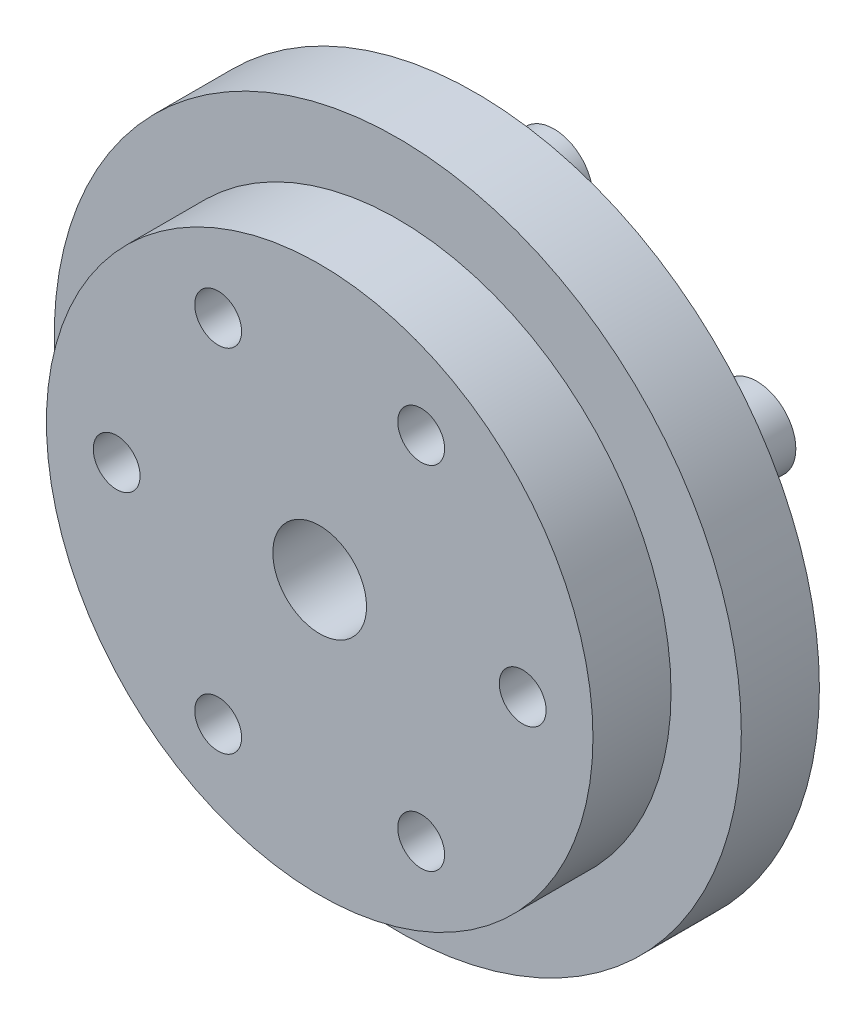
ISO-10303-21;
HEADER;
FILE_DESCRIPTION(('STEP AP214'),'2;1');
FILE_NAME('part.step','',(''),(''),'','','');
FILE_SCHEMA(('AUTOMOTIVE_DESIGN { 1 0 10303 214 1 1 1 1 }'));
ENDSEC;
DATA;
#1=APPLICATION_CONTEXT('core data for automotive mechanical design processes');
#2=APPLICATION_PROTOCOL_DEFINITION('international standard','automotive_design',2000,#1);
#3=PRODUCT_CONTEXT('',#1,'mechanical');
#4=PRODUCT('Part','Part','',(#3));
#5=PRODUCT_RELATED_PRODUCT_CATEGORY('part','',(#4));
#6=PRODUCT_DEFINITION_FORMATION('','',#4);
#7=PRODUCT_DEFINITION_CONTEXT('part definition',#1,'design');
#8=PRODUCT_DEFINITION('design','',#6,#7);
#9=PRODUCT_DEFINITION_SHAPE('','',#8);
#10=(LENGTH_UNIT() NAMED_UNIT(*) SI_UNIT(.MILLI.,.METRE.));
#11=(NAMED_UNIT(*) PLANE_ANGLE_UNIT() SI_UNIT($,.RADIAN.));
#12=(NAMED_UNIT(*) SI_UNIT($,.STERADIAN.) SOLID_ANGLE_UNIT());
#13=UNCERTAINTY_MEASURE_WITH_UNIT(LENGTH_MEASURE(1.E-05),#10,'distance_accuracy_value','');
#14=(GEOMETRIC_REPRESENTATION_CONTEXT(3) GLOBAL_UNCERTAINTY_ASSIGNED_CONTEXT((#13)) GLOBAL_UNIT_ASSIGNED_CONTEXT((#10,
#11,#12)) REPRESENTATION_CONTEXT('',''));
#15=CARTESIAN_POINT('',(0.,0.,0.));
#16=DIRECTION('',(0.,0.,1.));
#17=DIRECTION('',(1.,0.,0.));
#18=AXIS2_PLACEMENT_3D('',#15,#16,#17);
#19=CARTESIAN_POINT('',(0.,0.,0.));
#20=DIRECTION('',(0.,0.,1.));
#21=DIRECTION('',(1.,0.,0.));
#22=AXIS2_PLACEMENT_3D('',#19,#20,#21);
#23=CYLINDRICAL_SURFACE('',#22,8.);
#24=CARTESIAN_POINT('',(0.,0.,0.));
#25=DIRECTION('',(0.,0.,1.));
#26=DIRECTION('',(1.,0.,0.));
#27=AXIS2_PLACEMENT_3D('',#24,#25,#26);
#28=CIRCLE('',#27,8.);
#29=CARTESIAN_POINT('',(8.,0.,0.));
#30=VERTEX_POINT('',#29);
#31=EDGE_CURVE('E76',#30,#30,#28,.T.);
#32=ORIENTED_EDGE('',*,*,#31,.F.);
#33=EDGE_LOOP('',(#32));
#34=FACE_BOUND('',#33,.T.);
#35=CARTESIAN_POINT('',(0.,0.,5.));
#36=DIRECTION('',(0.,0.,1.));
#37=DIRECTION('',(1.,0.,0.));
#38=AXIS2_PLACEMENT_3D('',#35,#36,#37);
#39=CIRCLE('',#38,8.);
#40=CARTESIAN_POINT('',(8.,0.,5.));
#41=VERTEX_POINT('',#40);
#42=EDGE_CURVE('E10',#41,#41,#39,.F.);
#43=ORIENTED_EDGE('',*,*,#42,.F.);
#44=EDGE_LOOP('',(#43));
#45=FACE_BOUND('',#44,.T.);
#46=ADVANCED_FACE('F35',(#34,#45),#23,.F.);
#47=CARTESIAN_POINT('',(0.,0.,5.));
#48=DIRECTION('',(0.,0.,-1.));
#49=DIRECTION('',(-1.,0.,0.));
#50=AXIS2_PLACEMENT_3D('',#47,#48,#49);
#51=CYLINDRICAL_SURFACE('',#50,22.);
#52=CARTESIAN_POINT('',(0.,0.,5.));
#53=DIRECTION('',(0.,0.,1.));
#54=DIRECTION('',(1.,0.,0.));
#55=AXIS2_PLACEMENT_3D('',#52,#53,#54);
#56=CIRCLE('',#55,22.);
#57=CARTESIAN_POINT('',(22.,0.,5.));
#58=VERTEX_POINT('',#57);
#59=EDGE_CURVE('E68',#58,#58,#56,.T.);
#60=ORIENTED_EDGE('',*,*,#59,.F.);
#61=EDGE_LOOP('',(#60));
#62=FACE_BOUND('',#61,.T.);
#63=CARTESIAN_POINT('',(0.,0.,0.));
#64=DIRECTION('',(0.,0.,1.));
#65=DIRECTION('',(1.,0.,0.));
#66=AXIS2_PLACEMENT_3D('',#63,#64,#65);
#67=CIRCLE('',#66,22.);
#68=CARTESIAN_POINT('',(22.,0.,0.));
#69=VERTEX_POINT('',#68);
#70=EDGE_CURVE('E65',#69,#69,#67,.T.);
#71=ORIENTED_EDGE('',*,*,#70,.T.);
#72=EDGE_LOOP('',(#71));
#73=FACE_BOUND('',#72,.T.);
#74=ADVANCED_FACE('F37',(#62,#73),#51,.T.);
#75=CARTESIAN_POINT('',(0.,0.,5.));
#76=DIRECTION('',(0.,0.,1.));
#77=DIRECTION('',(1.,0.,0.));
#78=AXIS2_PLACEMENT_3D('',#75,#76,#77);
#79=PLANE('',#78);
#80=CARTESIAN_POINT('',(0.,0.,5.));
#81=DIRECTION('',(0.,0.,1.));
#82=DIRECTION('',(1.,0.,0.));
#83=AXIS2_PLACEMENT_3D('',#80,#81,#82);
#84=CIRCLE('',#83,17.5);
#85=CARTESIAN_POINT('',(17.5,0.,5.));
#86=VERTEX_POINT('',#85);
#87=EDGE_CURVE('E64',#86,#86,#84,.T.);
#88=ORIENTED_EDGE('',*,*,#87,.F.);
#89=EDGE_LOOP('',(#88));
#90=FACE_BOUND('',#89,.T.);
#91=ORIENTED_EDGE('',*,*,#59,.T.);
#92=EDGE_LOOP('',(#91));
#93=FACE_BOUND('',#92,.T.);
#94=ADVANCED_FACE('F172',(#90,#93),#79,.T.);
#95=CARTESIAN_POINT('',(0.,0.,0.));
#96=DIRECTION('',(0.,0.,1.));
#97=DIRECTION('',(1.,0.,0.));
#98=AXIS2_PLACEMENT_3D('',#95,#96,#97);
#99=PLANE('',#98);
#100=CARTESIAN_POINT('',(12.9903810567665,7.50000000000015,0.));
#101=DIRECTION('',(0.,0.,1.));
#102=DIRECTION('',(1.,0.,0.));
#103=AXIS2_PLACEMENT_3D('',#100,#101,#102);
#104=CIRCLE('',#103,2.5);
#105=CARTESIAN_POINT('',(15.4903810567665,7.50000000000015,0.));
#106=VERTEX_POINT('',#105);
#107=EDGE_CURVE('E42',#106,#106,#104,.F.);
#108=ORIENTED_EDGE('',*,*,#107,.F.);
#109=EDGE_LOOP('',(#108));
#110=FACE_BOUND('',#109,.T.);
#111=CARTESIAN_POINT('',(12.9903810567667,-7.49999999999988,0.));
#112=DIRECTION('',(0.,0.,1.));
#113=DIRECTION('',(1.,0.,0.));
#114=AXIS2_PLACEMENT_3D('',#111,#112,#113);
#115=CIRCLE('',#114,2.5);
#116=CARTESIAN_POINT('',(15.4903810567667,-7.49999999999988,0.));
#117=VERTEX_POINT('',#116);
#118=EDGE_CURVE('E46',#117,#117,#115,.F.);
#119=ORIENTED_EDGE('',*,*,#118,.F.);
#120=EDGE_LOOP('',(#119));
#121=FACE_BOUND('',#120,.T.);
#122=CARTESIAN_POINT('',(1.04744440165294E-13,-15.,0.));
#123=DIRECTION('',(0.,0.,1.));
#124=DIRECTION('',(1.,0.,0.));
#125=AXIS2_PLACEMENT_3D('',#122,#123,#124);
#126=CIRCLE('',#125,2.5);
#127=CARTESIAN_POINT('',(2.5000000000001,-15.,0.));
#128=VERTEX_POINT('',#127);
#129=EDGE_CURVE('E50',#128,#128,#126,.F.);
#130=ORIENTED_EDGE('',*,*,#129,.F.);
#131=EDGE_LOOP('',(#130));
#132=FACE_BOUND('',#131,.T.);
#133=CARTESIAN_POINT('',(-12.9903810567665,-7.50000000000006,0.));
#134=DIRECTION('',(0.,0.,1.));
#135=DIRECTION('',(1.,0.,0.));
#136=AXIS2_PLACEMENT_3D('',#133,#134,#135);
#137=CIRCLE('',#136,2.5);
#138=CARTESIAN_POINT('',(-10.4903810567665,-7.50000000000006,0.));
#139=VERTEX_POINT('',#138);
#140=EDGE_CURVE('E55',#139,#139,#137,.F.);
#141=ORIENTED_EDGE('',*,*,#140,.F.);
#142=EDGE_LOOP('',(#141));
#143=FACE_BOUND('',#142,.T.);
#144=CARTESIAN_POINT('',(-12.9903810567666,7.49999999999997,0.));
#145=DIRECTION('',(0.,0.,1.));
#146=DIRECTION('',(1.,0.,0.));
#147=AXIS2_PLACEMENT_3D('',#144,#145,#146);
#148=CIRCLE('',#147,2.5);
#149=CARTESIAN_POINT('',(-10.4903810567666,7.49999999999997,0.));
#150=VERTEX_POINT('',#149);
#151=EDGE_CURVE('E58',#150,#150,#148,.F.);
#152=ORIENTED_EDGE('',*,*,#151,.F.);
#153=EDGE_LOOP('',(#152));
#154=FACE_BOUND('',#153,.T.);
#155=CARTESIAN_POINT('',(0.,15.,0.));
#156=DIRECTION('',(0.,0.,1.));
#157=DIRECTION('',(1.,0.,0.));
#158=AXIS2_PLACEMENT_3D('',#155,#156,#157);
#159=CIRCLE('',#158,2.5);
#160=CARTESIAN_POINT('',(2.5,15.,0.));
#161=VERTEX_POINT('',#160);
#162=EDGE_CURVE('E61',#161,#161,#159,.F.);
#163=ORIENTED_EDGE('',*,*,#162,.F.);
#164=EDGE_LOOP('',(#163));
#165=FACE_BOUND('',#164,.T.);
#166=ORIENTED_EDGE('',*,*,#31,.T.);
#167=EDGE_LOOP('',(#166));
#168=FACE_BOUND('',#167,.T.);
#169=ORIENTED_EDGE('',*,*,#70,.F.);
#170=EDGE_LOOP('',(#169));
#171=FACE_BOUND('',#170,.T.);
#172=ADVANCED_FACE('F161',(#110,#121,#132,#143,#154,#165,#168,#171),#99,.F.);
#173=CARTESIAN_POINT('',(0.,0.,10.));
#174=DIRECTION('',(0.,0.,-1.));
#175=DIRECTION('',(-1.,0.,0.));
#176=AXIS2_PLACEMENT_3D('',#173,#174,#175);
#177=CYLINDRICAL_SURFACE('',#176,17.5);
#178=CARTESIAN_POINT('',(0.,0.,10.));
#179=DIRECTION('',(0.,0.,1.));
#180=DIRECTION('',(1.,0.,0.));
#181=AXIS2_PLACEMENT_3D('',#178,#179,#180);
#182=CIRCLE('',#181,17.5);
#183=CARTESIAN_POINT('',(17.5,0.,10.));
#184=VERTEX_POINT('',#183);
#185=EDGE_CURVE('E69',#184,#184,#182,.T.);
#186=ORIENTED_EDGE('',*,*,#185,.F.);
#187=EDGE_LOOP('',(#186));
#188=FACE_BOUND('',#187,.T.);
#189=ORIENTED_EDGE('',*,*,#87,.T.);
#190=EDGE_LOOP('',(#189));
#191=FACE_BOUND('',#190,.T.);
#192=ADVANCED_FACE('F151',(#188,#191),#177,.T.);
#193=CARTESIAN_POINT('',(0.,0.,10.));
#194=DIRECTION('',(0.,0.,1.));
#195=DIRECTION('',(1.,0.,0.));
#196=AXIS2_PLACEMENT_3D('',#193,#194,#195);
#197=PLANE('',#196);
#198=CARTESIAN_POINT('',(13.,0.,10.));
#199=DIRECTION('',(0.,0.,1.));
#200=DIRECTION('',(1.,0.,0.));
#201=AXIS2_PLACEMENT_3D('',#198,#199,#200);
#202=CIRCLE('',#201,1.5);
#203=CARTESIAN_POINT('',(14.5,0.,10.));
#204=VERTEX_POINT('',#203);
#205=EDGE_CURVE('E105',#204,#204,#202,.T.);
#206=ORIENTED_EDGE('',*,*,#205,.F.);
#207=EDGE_LOOP('',(#206));
#208=FACE_BOUND('',#207,.T.);
#209=CARTESIAN_POINT('',(6.50000000000013,11.2583302491976,10.));
#210=DIRECTION('',(0.,0.,1.));
#211=DIRECTION('',(1.,0.,0.));
#212=AXIS2_PLACEMENT_3D('',#209,#210,#211);
#213=CIRCLE('',#212,1.5);
#214=CARTESIAN_POINT('',(8.00000000000013,11.2583302491976,10.));
#215=VERTEX_POINT('',#214);
#216=EDGE_CURVE('E84',#215,#215,#213,.T.);
#217=ORIENTED_EDGE('',*,*,#216,.F.);
#218=EDGE_LOOP('',(#217));
#219=FACE_BOUND('',#218,.T.);
#220=CARTESIAN_POINT('',(-6.4999999999999,11.2583302491978,10.));
#221=DIRECTION('',(0.,0.,1.));
#222=DIRECTION('',(1.,0.,0.));
#223=AXIS2_PLACEMENT_3D('',#220,#221,#222);
#224=CIRCLE('',#223,1.5);
#225=CARTESIAN_POINT('',(-4.9999999999999,11.2583302491978,10.));
#226=VERTEX_POINT('',#225);
#227=EDGE_CURVE('E83',#226,#226,#224,.T.);
#228=ORIENTED_EDGE('',*,*,#227,.F.);
#229=EDGE_LOOP('',(#228));
#230=FACE_BOUND('',#229,.T.);
#231=CARTESIAN_POINT('',(-13.,0.,10.));
#232=DIRECTION('',(0.,0.,1.));
#233=DIRECTION('',(1.,0.,0.));
#234=AXIS2_PLACEMENT_3D('',#231,#232,#233);
#235=CIRCLE('',#234,1.5);
#236=CARTESIAN_POINT('',(-11.5,0.,10.));
#237=VERTEX_POINT('',#236);
#238=EDGE_CURVE('E90',#237,#237,#235,.T.);
#239=ORIENTED_EDGE('',*,*,#238,.F.);
#240=EDGE_LOOP('',(#239));
#241=FACE_BOUND('',#240,.T.);
#242=CARTESIAN_POINT('',(-6.50000000000005,-11.2583302491977,10.));
#243=DIRECTION('',(0.,0.,1.));
#244=DIRECTION('',(1.,0.,0.));
#245=AXIS2_PLACEMENT_3D('',#242,#243,#244);
#246=CIRCLE('',#245,1.5);
#247=CARTESIAN_POINT('',(-5.00000000000005,-11.2583302491977,10.));
#248=VERTEX_POINT('',#247);
#249=EDGE_CURVE('E96',#248,#248,#246,.T.);
#250=ORIENTED_EDGE('',*,*,#249,.F.);
#251=EDGE_LOOP('',(#250));
#252=FACE_BOUND('',#251,.T.);
#253=CARTESIAN_POINT('',(6.49999999999997,-11.2583302491977,10.));
#254=DIRECTION('',(0.,0.,1.));
#255=DIRECTION('',(1.,0.,0.));
#256=AXIS2_PLACEMENT_3D('',#253,#254,#255);
#257=CIRCLE('',#256,1.5);
#258=CARTESIAN_POINT('',(7.99999999999997,-11.2583302491977,10.));
#259=VERTEX_POINT('',#258);
#260=EDGE_CURVE('E102',#259,#259,#257,.T.);
#261=ORIENTED_EDGE('',*,*,#260,.F.);
#262=EDGE_LOOP('',(#261));
#263=FACE_BOUND('',#262,.T.);
#264=ORIENTED_EDGE('',*,*,#185,.T.);
#265=EDGE_LOOP('',(#264));
#266=FACE_BOUND('',#265,.T.);
#267=CARTESIAN_POINT('',(0.,0.,10.));
#268=DIRECTION('',(0.,0.,1.));
#269=DIRECTION('',(1.,0.,0.));
#270=AXIS2_PLACEMENT_3D('',#267,#268,#269);
#271=CIRCLE('',#270,3.);
#272=CARTESIAN_POINT('',(3.,0.,10.));
#273=VERTEX_POINT('',#272);
#274=EDGE_CURVE('E134',#273,#273,#271,.T.);
#275=ORIENTED_EDGE('',*,*,#274,.F.);
#276=EDGE_LOOP('',(#275));
#277=FACE_BOUND('',#276,.T.);
#278=ADVANCED_FACE('F148',(#208,#219,#230,#241,#252,#263,#266,#277),#197,.T.);
#279=CARTESIAN_POINT('',(6.49999999999997,-11.2583302491977,7.));
#280=DIRECTION('',(0.,0.,1.));
#281=DIRECTION('',(1.,0.,0.));
#282=AXIS2_PLACEMENT_3D('',#279,#280,#281);
#283=CYLINDRICAL_SURFACE('',#282,1.5);
#284=CARTESIAN_POINT('',(6.49999999999997,-11.2583302491977,7.));
#285=DIRECTION('',(0.,0.,1.));
#286=DIRECTION('',(1.,0.,0.));
#287=AXIS2_PLACEMENT_3D('',#284,#285,#286);
#288=CIRCLE('',#287,1.5);
#289=CARTESIAN_POINT('',(7.99999999999997,-11.2583302491977,7.));
#290=VERTEX_POINT('',#289);
#291=EDGE_CURVE('E99',#290,#290,#288,.T.);
#292=ORIENTED_EDGE('',*,*,#291,.F.);
#293=EDGE_LOOP('',(#292));
#294=FACE_BOUND('',#293,.T.);
#295=ORIENTED_EDGE('',*,*,#260,.T.);
#296=EDGE_LOOP('',(#295));
#297=FACE_BOUND('',#296,.T.);
#298=ADVANCED_FACE('F150',(#294,#297),#283,.F.);
#299=CARTESIAN_POINT('',(6.49999999999997,-11.2583302491977,7.));
#300=DIRECTION('',(0.,0.,1.));
#301=DIRECTION('',(1.,0.,0.));
#302=AXIS2_PLACEMENT_3D('',#299,#300,#301);
#303=PLANE('',#302);
#304=ORIENTED_EDGE('',*,*,#291,.T.);
#305=EDGE_LOOP('',(#304));
#306=FACE_BOUND('',#305,.T.);
#307=ADVANCED_FACE('F158',(#306),#303,.T.);
#308=CARTESIAN_POINT('',(-6.50000000000005,-11.2583302491977,7.));
#309=DIRECTION('',(0.,0.,1.));
#310=DIRECTION('',(1.,0.,0.));
#311=AXIS2_PLACEMENT_3D('',#308,#309,#310);
#312=CYLINDRICAL_SURFACE('',#311,1.5);
#313=CARTESIAN_POINT('',(-6.50000000000005,-11.2583302491977,7.));
#314=DIRECTION('',(0.,0.,1.));
#315=DIRECTION('',(1.,0.,0.));
#316=AXIS2_PLACEMENT_3D('',#313,#314,#315);
#317=CIRCLE('',#316,1.5);
#318=CARTESIAN_POINT('',(-5.00000000000005,-11.2583302491977,7.));
#319=VERTEX_POINT('',#318);
#320=EDGE_CURVE('E93',#319,#319,#317,.T.);
#321=ORIENTED_EDGE('',*,*,#320,.F.);
#322=EDGE_LOOP('',(#321));
#323=FACE_BOUND('',#322,.T.);
#324=ORIENTED_EDGE('',*,*,#249,.T.);
#325=EDGE_LOOP('',(#324));
#326=FACE_BOUND('',#325,.T.);
#327=ADVANCED_FACE('F197',(#323,#326),#312,.F.);
#328=CARTESIAN_POINT('',(-6.50000000000005,-11.2583302491977,7.));
#329=DIRECTION('',(0.,0.,1.));
#330=DIRECTION('',(1.,0.,0.));
#331=AXIS2_PLACEMENT_3D('',#328,#329,#330);
#332=PLANE('',#331);
#333=ORIENTED_EDGE('',*,*,#320,.T.);
#334=EDGE_LOOP('',(#333));
#335=FACE_BOUND('',#334,.T.);
#336=ADVANCED_FACE('F193',(#335),#332,.T.);
#337=CARTESIAN_POINT('',(-13.,0.,7.));
#338=DIRECTION('',(0.,0.,1.));
#339=DIRECTION('',(1.,0.,0.));
#340=AXIS2_PLACEMENT_3D('',#337,#338,#339);
#341=CYLINDRICAL_SURFACE('',#340,1.5);
#342=CARTESIAN_POINT('',(-13.,0.,7.));
#343=DIRECTION('',(0.,0.,1.));
#344=DIRECTION('',(1.,0.,0.));
#345=AXIS2_PLACEMENT_3D('',#342,#343,#344);
#346=CIRCLE('',#345,1.5);
#347=CARTESIAN_POINT('',(-11.5,0.,7.));
#348=VERTEX_POINT('',#347);
#349=EDGE_CURVE('E87',#348,#348,#346,.T.);
#350=ORIENTED_EDGE('',*,*,#349,.F.);
#351=EDGE_LOOP('',(#350));
#352=FACE_BOUND('',#351,.T.);
#353=ORIENTED_EDGE('',*,*,#238,.T.);
#354=EDGE_LOOP('',(#353));
#355=FACE_BOUND('',#354,.T.);
#356=ADVANCED_FACE('F189',(#352,#355),#341,.F.);
#357=CARTESIAN_POINT('',(-13.,0.,7.));
#358=DIRECTION('',(0.,0.,1.));
#359=DIRECTION('',(1.,0.,0.));
#360=AXIS2_PLACEMENT_3D('',#357,#358,#359);
#361=PLANE('',#360);
#362=ORIENTED_EDGE('',*,*,#349,.T.);
#363=EDGE_LOOP('',(#362));
#364=FACE_BOUND('',#363,.T.);
#365=ADVANCED_FACE('F185',(#364),#361,.T.);
#366=CARTESIAN_POINT('',(-6.4999999999999,11.2583302491978,7.));
#367=DIRECTION('',(0.,0.,1.));
#368=DIRECTION('',(1.,0.,0.));
#369=AXIS2_PLACEMENT_3D('',#366,#367,#368);
#370=CYLINDRICAL_SURFACE('',#369,1.5);
#371=CARTESIAN_POINT('',(-6.4999999999999,11.2583302491978,7.));
#372=DIRECTION('',(0.,0.,1.));
#373=DIRECTION('',(1.,0.,0.));
#374=AXIS2_PLACEMENT_3D('',#371,#372,#373);
#375=CIRCLE('',#374,1.5);
#376=CARTESIAN_POINT('',(-4.9999999999999,11.2583302491978,7.));
#377=VERTEX_POINT('',#376);
#378=EDGE_CURVE('E80',#377,#377,#375,.T.);
#379=ORIENTED_EDGE('',*,*,#378,.F.);
#380=EDGE_LOOP('',(#379));
#381=FACE_BOUND('',#380,.T.);
#382=ORIENTED_EDGE('',*,*,#227,.T.);
#383=EDGE_LOOP('',(#382));
#384=FACE_BOUND('',#383,.T.);
#385=ADVANCED_FACE('F181',(#381,#384),#370,.F.);
#386=CARTESIAN_POINT('',(-6.4999999999999,11.2583302491978,7.));
#387=DIRECTION('',(0.,0.,1.));
#388=DIRECTION('',(1.,0.,0.));
#389=AXIS2_PLACEMENT_3D('',#386,#387,#388);
#390=PLANE('',#389);
#391=ORIENTED_EDGE('',*,*,#378,.T.);
#392=EDGE_LOOP('',(#391));
#393=FACE_BOUND('',#392,.T.);
#394=ADVANCED_FACE('F177',(#393),#390,.T.);
#395=CARTESIAN_POINT('',(6.50000000000013,11.2583302491976,7.));
#396=DIRECTION('',(0.,0.,1.));
#397=DIRECTION('',(1.,0.,0.));
#398=AXIS2_PLACEMENT_3D('',#395,#396,#397);
#399=CYLINDRICAL_SURFACE('',#398,1.5);
#400=CARTESIAN_POINT('',(6.50000000000013,11.2583302491976,7.));
#401=DIRECTION('',(0.,0.,1.));
#402=DIRECTION('',(1.,0.,0.));
#403=AXIS2_PLACEMENT_3D('',#400,#401,#402);
#404=CIRCLE('',#403,1.5);
#405=CARTESIAN_POINT('',(8.00000000000013,11.2583302491976,7.));
#406=VERTEX_POINT('',#405);
#407=EDGE_CURVE('E106',#406,#406,#404,.T.);
#408=ORIENTED_EDGE('',*,*,#407,.F.);
#409=EDGE_LOOP('',(#408));
#410=FACE_BOUND('',#409,.T.);
#411=ORIENTED_EDGE('',*,*,#216,.T.);
#412=EDGE_LOOP('',(#411));
#413=FACE_BOUND('',#412,.T.);
#414=ADVANCED_FACE('F180',(#410,#413),#399,.F.);
#415=CARTESIAN_POINT('',(6.50000000000013,11.2583302491976,7.));
#416=DIRECTION('',(0.,0.,1.));
#417=DIRECTION('',(1.,0.,0.));
#418=AXIS2_PLACEMENT_3D('',#415,#416,#417);
#419=PLANE('',#418);
#420=ORIENTED_EDGE('',*,*,#407,.T.);
#421=EDGE_LOOP('',(#420));
#422=FACE_BOUND('',#421,.T.);
#423=ADVANCED_FACE('F205',(#422),#419,.T.);
#424=CARTESIAN_POINT('',(13.,0.,7.));
#425=DIRECTION('',(0.,0.,1.));
#426=DIRECTION('',(1.,0.,0.));
#427=AXIS2_PLACEMENT_3D('',#424,#425,#426);
#428=CYLINDRICAL_SURFACE('',#427,1.5);
#429=CARTESIAN_POINT('',(13.,0.,7.));
#430=DIRECTION('',(0.,0.,1.));
#431=DIRECTION('',(1.,0.,0.));
#432=AXIS2_PLACEMENT_3D('',#429,#430,#431);
#433=CIRCLE('',#432,1.5);
#434=CARTESIAN_POINT('',(14.5,0.,7.));
#435=VERTEX_POINT('',#434);
#436=EDGE_CURVE('E79',#435,#435,#433,.T.);
#437=ORIENTED_EDGE('',*,*,#436,.F.);
#438=EDGE_LOOP('',(#437));
#439=FACE_BOUND('',#438,.T.);
#440=ORIENTED_EDGE('',*,*,#205,.T.);
#441=EDGE_LOOP('',(#440));
#442=FACE_BOUND('',#441,.T.);
#443=ADVANCED_FACE('F208',(#439,#442),#428,.F.);
#444=CARTESIAN_POINT('',(13.,0.,7.));
#445=DIRECTION('',(0.,0.,1.));
#446=DIRECTION('',(1.,0.,0.));
#447=AXIS2_PLACEMENT_3D('',#444,#445,#446);
#448=PLANE('',#447);
#449=ORIENTED_EDGE('',*,*,#436,.T.);
#450=EDGE_LOOP('',(#449));
#451=FACE_BOUND('',#450,.T.);
#452=ADVANCED_FACE('F215',(#451),#448,.T.);
#453=CARTESIAN_POINT('',(0.,15.,-5.));
#454=DIRECTION('',(0.,0.,1.));
#455=DIRECTION('',(1.,0.,0.));
#456=AXIS2_PLACEMENT_3D('',#453,#454,#455);
#457=CYLINDRICAL_SURFACE('',#456,2.5);
#458=CARTESIAN_POINT('',(0.,15.,-5.));
#459=DIRECTION('',(0.,0.,-1.));
#460=DIRECTION('',(-1.,0.,0.));
#461=AXIS2_PLACEMENT_3D('',#458,#459,#460);
#462=CIRCLE('',#461,2.5);
#463=CARTESIAN_POINT('',(-2.5,15.,-5.));
#464=VERTEX_POINT('',#463);
#465=EDGE_CURVE('E109',#464,#464,#462,.T.);
#466=ORIENTED_EDGE('',*,*,#465,.F.);
#467=EDGE_LOOP('',(#466));
#468=FACE_BOUND('',#467,.T.);
#469=ORIENTED_EDGE('',*,*,#162,.T.);
#470=EDGE_LOOP('',(#469));
#471=FACE_BOUND('',#470,.T.);
#472=ADVANCED_FACE('F219',(#468,#471),#457,.T.);
#473=CARTESIAN_POINT('',(0.,15.,-5.));
#474=DIRECTION('',(0.,0.,-1.));
#475=DIRECTION('',(-1.,0.,0.));
#476=AXIS2_PLACEMENT_3D('',#473,#474,#475);
#477=PLANE('',#476);
#478=ORIENTED_EDGE('',*,*,#465,.T.);
#479=EDGE_LOOP('',(#478));
#480=FACE_BOUND('',#479,.T.);
#481=ADVANCED_FACE('F223',(#480),#477,.T.);
#482=CARTESIAN_POINT('',(-12.9903810567666,7.49999999999997,-5.));
#483=DIRECTION('',(0.,0.,1.));
#484=DIRECTION('',(1.,0.,0.));
#485=AXIS2_PLACEMENT_3D('',#482,#483,#484);
#486=CYLINDRICAL_SURFACE('',#485,2.5);
#487=CARTESIAN_POINT('',(-12.9903810567666,7.49999999999997,-5.));
#488=DIRECTION('',(0.,0.,-1.));
#489=DIRECTION('',(-1.,0.,0.));
#490=AXIS2_PLACEMENT_3D('',#487,#488,#489);
#491=CIRCLE('',#490,2.5);
#492=CARTESIAN_POINT('',(-15.4903810567666,7.49999999999997,-5.));
#493=VERTEX_POINT('',#492);
#494=EDGE_CURVE('E118',#493,#493,#491,.T.);
#495=ORIENTED_EDGE('',*,*,#494,.F.);
#496=EDGE_LOOP('',(#495));
#497=FACE_BOUND('',#496,.T.);
#498=ORIENTED_EDGE('',*,*,#151,.T.);
#499=EDGE_LOOP('',(#498));
#500=FACE_BOUND('',#499,.T.);
#501=ADVANCED_FACE('F227',(#497,#500),#486,.T.);
#502=CARTESIAN_POINT('',(-12.9903810567666,7.49999999999997,-5.));
#503=DIRECTION('',(0.,0.,-1.));
#504=DIRECTION('',(-1.,0.,0.));
#505=AXIS2_PLACEMENT_3D('',#502,#503,#504);
#506=PLANE('',#505);
#507=ORIENTED_EDGE('',*,*,#494,.T.);
#508=EDGE_LOOP('',(#507));
#509=FACE_BOUND('',#508,.T.);
#510=ADVANCED_FACE('F229',(#509),#506,.T.);
#511=CARTESIAN_POINT('',(-12.9903810567665,-7.50000000000006,-5.));
#512=DIRECTION('',(0.,0.,1.));
#513=DIRECTION('',(1.,0.,0.));
#514=AXIS2_PLACEMENT_3D('',#511,#512,#513);
#515=CYLINDRICAL_SURFACE('',#514,2.5);
#516=CARTESIAN_POINT('',(-12.9903810567665,-7.50000000000006,-5.));
#517=DIRECTION('',(0.,0.,-1.));
#518=DIRECTION('',(-1.,0.,0.));
#519=AXIS2_PLACEMENT_3D('',#516,#517,#518);
#520=CIRCLE('',#519,2.5);
#521=CARTESIAN_POINT('',(-15.4903810567665,-7.50000000000006,-5.));
#522=VERTEX_POINT('',#521);
#523=EDGE_CURVE('E121',#522,#522,#520,.T.);
#524=ORIENTED_EDGE('',*,*,#523,.F.);
#525=EDGE_LOOP('',(#524));
#526=FACE_BOUND('',#525,.T.);
#527=ORIENTED_EDGE('',*,*,#140,.T.);
#528=EDGE_LOOP('',(#527));
#529=FACE_BOUND('',#528,.T.);
#530=ADVANCED_FACE('F232',(#526,#529),#515,.T.);
#531=CARTESIAN_POINT('',(-12.9903810567665,-7.50000000000006,-5.));
#532=DIRECTION('',(0.,0.,-1.));
#533=DIRECTION('',(-1.,0.,0.));
#534=AXIS2_PLACEMENT_3D('',#531,#532,#533);
#535=PLANE('',#534);
#536=ORIENTED_EDGE('',*,*,#523,.T.);
#537=EDGE_LOOP('',(#536));
#538=FACE_BOUND('',#537,.T.);
#539=ADVANCED_FACE('F237',(#538),#535,.T.);
#540=CARTESIAN_POINT('',(1.04744440165294E-13,-15.,-5.));
#541=DIRECTION('',(0.,0.,1.));
#542=DIRECTION('',(1.,0.,0.));
#543=AXIS2_PLACEMENT_3D('',#540,#541,#542);
#544=CYLINDRICAL_SURFACE('',#543,2.5);
#545=CARTESIAN_POINT('',(1.04744440165294E-13,-15.,-5.));
#546=DIRECTION('',(0.,0.,-1.));
#547=DIRECTION('',(-1.,0.,0.));
#548=AXIS2_PLACEMENT_3D('',#545,#546,#547);
#549=CIRCLE('',#548,2.5);
#550=CARTESIAN_POINT('',(-2.49999999999989,-15.,-5.));
#551=VERTEX_POINT('',#550);
#552=EDGE_CURVE('E124',#551,#551,#549,.T.);
#553=ORIENTED_EDGE('',*,*,#552,.F.);
#554=EDGE_LOOP('',(#553));
#555=FACE_BOUND('',#554,.T.);
#556=ORIENTED_EDGE('',*,*,#129,.T.);
#557=EDGE_LOOP('',(#556));
#558=FACE_BOUND('',#557,.T.);
#559=ADVANCED_FACE('F240',(#555,#558),#544,.T.);
#560=CARTESIAN_POINT('',(1.04744440165294E-13,-15.,-5.));
#561=DIRECTION('',(0.,0.,-1.));
#562=DIRECTION('',(-1.,0.,0.));
#563=AXIS2_PLACEMENT_3D('',#560,#561,#562);
#564=PLANE('',#563);
#565=ORIENTED_EDGE('',*,*,#552,.T.);
#566=EDGE_LOOP('',(#565));
#567=FACE_BOUND('',#566,.T.);
#568=ADVANCED_FACE('F245',(#567),#564,.T.);
#569=CARTESIAN_POINT('',(12.9903810567667,-7.49999999999988,-5.));
#570=DIRECTION('',(0.,0.,1.));
#571=DIRECTION('',(1.,0.,0.));
#572=AXIS2_PLACEMENT_3D('',#569,#570,#571);
#573=CYLINDRICAL_SURFACE('',#572,2.5);
#574=CARTESIAN_POINT('',(12.9903810567667,-7.49999999999988,-5.));
#575=DIRECTION('',(0.,0.,-1.));
#576=DIRECTION('',(-1.,0.,0.));
#577=AXIS2_PLACEMENT_3D('',#574,#575,#576);
#578=CIRCLE('',#577,2.5);
#579=CARTESIAN_POINT('',(10.4903810567667,-7.49999999999988,-5.));
#580=VERTEX_POINT('',#579);
#581=EDGE_CURVE('E127',#580,#580,#578,.T.);
#582=ORIENTED_EDGE('',*,*,#581,.F.);
#583=EDGE_LOOP('',(#582));
#584=FACE_BOUND('',#583,.T.);
#585=ORIENTED_EDGE('',*,*,#118,.T.);
#586=EDGE_LOOP('',(#585));
#587=FACE_BOUND('',#586,.T.);
#588=ADVANCED_FACE('F248',(#584,#587),#573,.T.);
#589=CARTESIAN_POINT('',(12.9903810567667,-7.49999999999988,-5.));
#590=DIRECTION('',(0.,0.,-1.));
#591=DIRECTION('',(-1.,0.,0.));
#592=AXIS2_PLACEMENT_3D('',#589,#590,#591);
#593=PLANE('',#592);
#594=ORIENTED_EDGE('',*,*,#581,.T.);
#595=EDGE_LOOP('',(#594));
#596=FACE_BOUND('',#595,.T.);
#597=ADVANCED_FACE('F253',(#596),#593,.T.);
#598=CARTESIAN_POINT('',(12.9903810567665,7.50000000000015,-5.));
#599=DIRECTION('',(0.,0.,1.));
#600=DIRECTION('',(1.,0.,0.));
#601=AXIS2_PLACEMENT_3D('',#598,#599,#600);
#602=CYLINDRICAL_SURFACE('',#601,2.5);
#603=CARTESIAN_POINT('',(12.9903810567665,7.50000000000015,-5.));
#604=DIRECTION('',(0.,0.,-1.));
#605=DIRECTION('',(-1.,0.,0.));
#606=AXIS2_PLACEMENT_3D('',#603,#604,#605);
#607=CIRCLE('',#606,2.5);
#608=CARTESIAN_POINT('',(10.4903810567665,7.50000000000015,-5.));
#609=VERTEX_POINT('',#608);
#610=EDGE_CURVE('E130',#609,#609,#607,.T.);
#611=ORIENTED_EDGE('',*,*,#610,.F.);
#612=EDGE_LOOP('',(#611));
#613=FACE_BOUND('',#612,.T.);
#614=ORIENTED_EDGE('',*,*,#107,.T.);
#615=EDGE_LOOP('',(#614));
#616=FACE_BOUND('',#615,.T.);
#617=ADVANCED_FACE('F256',(#613,#616),#602,.T.);
#618=CARTESIAN_POINT('',(12.9903810567665,7.50000000000015,-5.));
#619=DIRECTION('',(0.,0.,-1.));
#620=DIRECTION('',(-1.,0.,0.));
#621=AXIS2_PLACEMENT_3D('',#618,#619,#620);
#622=PLANE('',#621);
#623=ORIENTED_EDGE('',*,*,#610,.T.);
#624=EDGE_LOOP('',(#623));
#625=FACE_BOUND('',#624,.T.);
#626=ADVANCED_FACE('F261',(#625),#622,.T.);
#627=CARTESIAN_POINT('',(0.,0.,5.));
#628=DIRECTION('',(0.,0.,1.));
#629=DIRECTION('',(1.,0.,0.));
#630=AXIS2_PLACEMENT_3D('',#627,#628,#629);
#631=PLANE('',#630);
#632=CARTESIAN_POINT('',(0.,0.,5.));
#633=DIRECTION('',(0.,0.,1.));
#634=DIRECTION('',(1.,0.,0.));
#635=AXIS2_PLACEMENT_3D('',#632,#633,#634);
#636=CIRCLE('',#635,3.);
#637=CARTESIAN_POINT('',(3.,0.,5.));
#638=VERTEX_POINT('',#637);
#639=EDGE_CURVE('E133',#638,#638,#636,.T.);
#640=ORIENTED_EDGE('',*,*,#639,.T.);
#641=EDGE_LOOP('',(#640));
#642=FACE_BOUND('',#641,.T.);
#643=ORIENTED_EDGE('',*,*,#42,.T.);
#644=EDGE_LOOP('',(#643));
#645=FACE_BOUND('',#644,.T.);
#646=ADVANCED_FACE('F140',(#642,#645),#631,.F.);
#647=CARTESIAN_POINT('',(0.,0.,5.));
#648=DIRECTION('',(0.,0.,1.));
#649=DIRECTION('',(1.,0.,0.));
#650=AXIS2_PLACEMENT_3D('',#647,#648,#649);
#651=CYLINDRICAL_SURFACE('',#650,3.);
#652=ORIENTED_EDGE('',*,*,#639,.F.);
#653=EDGE_LOOP('',(#652));
#654=FACE_BOUND('',#653,.T.);
#655=ORIENTED_EDGE('',*,*,#274,.T.);
#656=EDGE_LOOP('',(#655));
#657=FACE_BOUND('',#656,.T.);
#658=ADVANCED_FACE('F142',(#654,#657),#651,.F.);
#659=CLOSED_SHELL('',(#46,#74,#94,#172,#192,#278,#298,#307,#327,#336,#356,#365,#385,#394,#414,
#423,#443,#452,#472,#481,#501,#510,#530,#539,#559,#568,#588,#597,#617,#626,#646,#658));
#660=MANIFOLD_SOLID_BREP('B2',#659);
#661=ADVANCED_BREP_SHAPE_REPRESENTATION('',(#18,#660),#14);
#662=SHAPE_DEFINITION_REPRESENTATION(#9,#661);
ENDSEC;
END-ISO-10303-21;
